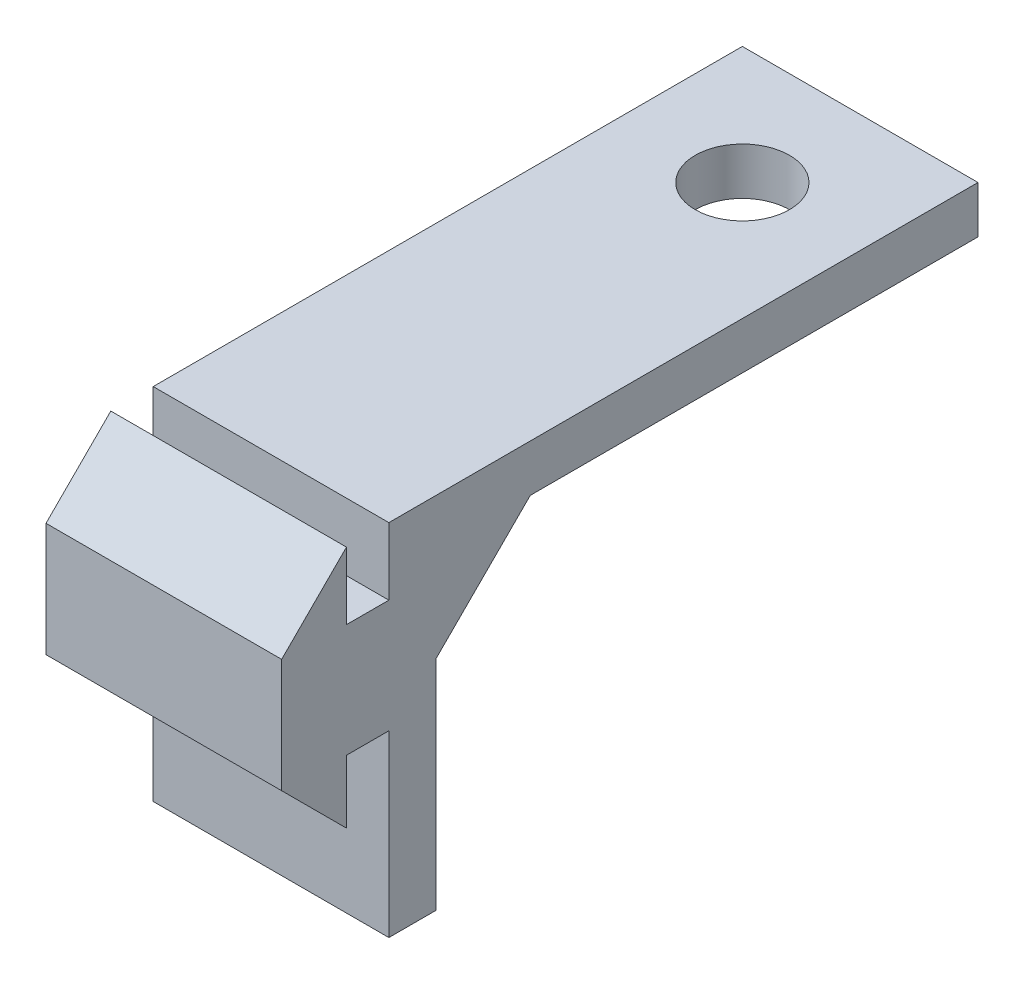
ISO-10303-21;
HEADER;
FILE_DESCRIPTION(('STEP AP214'),'2;1');
FILE_NAME('part.step','',(''),(''),'','','');
FILE_SCHEMA(('AUTOMOTIVE_DESIGN { 1 0 10303 214 1 1 1 1 }'));
ENDSEC;
DATA;
#1=APPLICATION_CONTEXT('core data for automotive mechanical design processes');
#2=APPLICATION_PROTOCOL_DEFINITION('international standard','automotive_design',2000,#1);
#3=PRODUCT_CONTEXT('',#1,'mechanical');
#4=PRODUCT('Part','Part','',(#3));
#5=PRODUCT_RELATED_PRODUCT_CATEGORY('part','',(#4));
#6=PRODUCT_DEFINITION_FORMATION('','',#4);
#7=PRODUCT_DEFINITION_CONTEXT('part definition',#1,'design');
#8=PRODUCT_DEFINITION('design','',#6,#7);
#9=PRODUCT_DEFINITION_SHAPE('','',#8);
#10=(LENGTH_UNIT() NAMED_UNIT(*) SI_UNIT(.MILLI.,.METRE.));
#11=(NAMED_UNIT(*) PLANE_ANGLE_UNIT() SI_UNIT($,.RADIAN.));
#12=(NAMED_UNIT(*) SI_UNIT($,.STERADIAN.) SOLID_ANGLE_UNIT());
#13=UNCERTAINTY_MEASURE_WITH_UNIT(LENGTH_MEASURE(1.E-05),#10,'distance_accuracy_value','');
#14=(GEOMETRIC_REPRESENTATION_CONTEXT(3) GLOBAL_UNCERTAINTY_ASSIGNED_CONTEXT((#13)) GLOBAL_UNIT_ASSIGNED_CONTEXT((#10,
#11,#12)) REPRESENTATION_CONTEXT('',''));
#15=CARTESIAN_POINT('',(0.,0.,0.));
#16=DIRECTION('',(0.,0.,1.));
#17=DIRECTION('',(1.,0.,0.));
#18=AXIS2_PLACEMENT_3D('',#15,#16,#17);
#19=CARTESIAN_POINT('',(10.,0.,-2.));
#20=DIRECTION('',(0.,0.,1.));
#21=DIRECTION('',(1.,0.,0.));
#22=AXIS2_PLACEMENT_3D('',#19,#20,#21);
#23=PLANE('',#22);
#24=DIRECTION('',(0.,1.,0.));
#25=VECTOR('',#24,1.);
#26=CARTESIAN_POINT('',(0.,0.,-2.));
#27=LINE('',#26,#25);
#28=CARTESIAN_POINT('',(0.,0.,-2.));
#29=VERTEX_POINT('',#28);
#30=CARTESIAN_POINT('',(0.,9.25000000000001,-2.));
#31=VERTEX_POINT('',#30);
#32=EDGE_CURVE('E174',#29,#31,#27,.T.);
#33=ORIENTED_EDGE('',*,*,#32,.T.);
#34=DIRECTION('',(-1.,0.,0.));
#35=VECTOR('',#34,1.);
#36=CARTESIAN_POINT('',(10.,9.25000000000001,-2.));
#37=LINE('',#36,#35);
#38=CARTESIAN_POINT('',(10.,9.25000000000001,-2.));
#39=VERTEX_POINT('',#38);
#40=EDGE_CURVE('E11',#39,#31,#37,.T.);
#41=ORIENTED_EDGE('',*,*,#40,.F.);
#42=DIRECTION('',(0.,1.,0.));
#43=VECTOR('',#42,1.);
#44=CARTESIAN_POINT('',(10.,0.,-2.));
#45=LINE('',#44,#43);
#46=CARTESIAN_POINT('',(10.,0.,-2.));
#47=VERTEX_POINT('',#46);
#48=EDGE_CURVE('E213',#47,#39,#45,.T.);
#49=ORIENTED_EDGE('',*,*,#48,.F.);
#50=DIRECTION('',(-1.,0.,0.));
#51=VECTOR('',#50,1.);
#52=CARTESIAN_POINT('',(10.,0.,-2.));
#53=LINE('',#52,#51);
#54=EDGE_CURVE('E51',#47,#29,#53,.T.);
#55=ORIENTED_EDGE('',*,*,#54,.T.);
#56=EDGE_LOOP('',(#33,#41,#49,#55));
#57=FACE_BOUND('',#56,.T.);
#58=ADVANCED_FACE('F35',(#57),#23,.F.);
#59=CARTESIAN_POINT('',(10.,3.62500000000001,3.625));
#60=DIRECTION('',(0.,0.707106781186548,0.707106781186547));
#61=DIRECTION('',(0.,-0.707106781186547,0.707106781186548));
#62=AXIS2_PLACEMENT_3D('',#59,#60,#61);
#63=PLANE('',#62);
#64=DIRECTION('',(0.,0.707106781186547,-0.707106781186548));
#65=VECTOR('',#64,1.);
#66=CARTESIAN_POINT('',(0.,3.62500000000001,3.625));
#67=LINE('',#66,#65);
#68=CARTESIAN_POINT('',(0.,13.25,-6.));
#69=VERTEX_POINT('',#68);
#70=EDGE_CURVE('E176',#31,#69,#67,.T.);
#71=ORIENTED_EDGE('',*,*,#70,.T.);
#72=DIRECTION('',(-1.,0.,0.));
#73=VECTOR('',#72,1.);
#74=CARTESIAN_POINT('',(10.,13.25,-6.));
#75=LINE('',#74,#73);
#76=CARTESIAN_POINT('',(10.,13.25,-6.));
#77=VERTEX_POINT('',#76);
#78=EDGE_CURVE('E43',#77,#69,#75,.T.);
#79=ORIENTED_EDGE('',*,*,#78,.F.);
#80=DIRECTION('',(0.,0.707106781186547,-0.707106781186548));
#81=VECTOR('',#80,1.);
#82=CARTESIAN_POINT('',(10.,3.62500000000001,3.625));
#83=LINE('',#82,#81);
#84=EDGE_CURVE('E110',#39,#77,#83,.T.);
#85=ORIENTED_EDGE('',*,*,#84,.F.);
#86=ORIENTED_EDGE('',*,*,#40,.T.);
#87=EDGE_LOOP('',(#71,#79,#85,#86));
#88=FACE_BOUND('',#87,.T.);
#89=ADVANCED_FACE('F288',(#88),#63,.F.);
#90=CARTESIAN_POINT('',(10.,13.25,0.));
#91=DIRECTION('',(0.,1.,0.));
#92=DIRECTION('',(0.,0.,1.));
#93=AXIS2_PLACEMENT_3D('',#90,#91,#92);
#94=PLANE('',#93);
#95=CARTESIAN_POINT('',(5.,13.25,-20.));
#96=DIRECTION('',(0.,1.,0.));
#97=DIRECTION('',(0.,0.,1.));
#98=AXIS2_PLACEMENT_3D('',#95,#96,#97);
#99=CIRCLE('',#98,2.);
#100=CARTESIAN_POINT('',(5.,13.25,-18.));
#101=VERTEX_POINT('',#100);
#102=EDGE_CURVE('E177',#101,#101,#99,.T.);
#103=ORIENTED_EDGE('',*,*,#102,.T.);
#104=EDGE_LOOP('',(#103));
#105=FACE_BOUND('',#104,.T.);
#106=DIRECTION('',(0.,0.,-1.));
#107=VECTOR('',#106,1.);
#108=CARTESIAN_POINT('',(0.,13.25,0.));
#109=LINE('',#108,#107);
#110=CARTESIAN_POINT('',(0.,13.25,-25.));
#111=VERTEX_POINT('',#110);
#112=EDGE_CURVE('E179',#69,#111,#109,.T.);
#113=ORIENTED_EDGE('',*,*,#112,.T.);
#114=DIRECTION('',(-1.,0.,0.));
#115=VECTOR('',#114,1.);
#116=CARTESIAN_POINT('',(10.,13.25,-25.));
#117=LINE('',#116,#115);
#118=CARTESIAN_POINT('',(10.,13.25,-25.));
#119=VERTEX_POINT('',#118);
#120=EDGE_CURVE('E235',#119,#111,#117,.T.);
#121=ORIENTED_EDGE('',*,*,#120,.F.);
#122=DIRECTION('',(0.,0.,-1.));
#123=VECTOR('',#122,1.);
#124=CARTESIAN_POINT('',(10.,13.25,0.));
#125=LINE('',#124,#123);
#126=EDGE_CURVE('E242',#77,#119,#125,.T.);
#127=ORIENTED_EDGE('',*,*,#126,.F.);
#128=ORIENTED_EDGE('',*,*,#78,.T.);
#129=EDGE_LOOP('',(#113,#121,#127,#128));
#130=FACE_BOUND('',#129,.T.);
#131=ADVANCED_FACE('F240',(#105,#130),#94,.F.);
#132=CARTESIAN_POINT('',(10.,0.,-25.));
#133=DIRECTION('',(0.,0.,-1.));
#134=DIRECTION('',(-1.,0.,0.));
#135=AXIS2_PLACEMENT_3D('',#132,#133,#134);
#136=PLANE('',#135);
#137=DIRECTION('',(0.,-1.,0.));
#138=VECTOR('',#137,1.);
#139=CARTESIAN_POINT('',(0.,0.,-25.));
#140=LINE('',#139,#138);
#141=CARTESIAN_POINT('',(0.,15.25,-25.));
#142=VERTEX_POINT('',#141);
#143=EDGE_CURVE('E182',#142,#111,#140,.T.);
#144=ORIENTED_EDGE('',*,*,#143,.F.);
#145=DIRECTION('',(-1.,0.,0.));
#146=VECTOR('',#145,1.);
#147=CARTESIAN_POINT('',(10.,15.25,-25.));
#148=LINE('',#147,#146);
#149=CARTESIAN_POINT('',(10.,15.25,-25.));
#150=VERTEX_POINT('',#149);
#151=EDGE_CURVE('E233',#150,#142,#148,.T.);
#152=ORIENTED_EDGE('',*,*,#151,.F.);
#153=DIRECTION('',(0.,-1.,0.));
#154=VECTOR('',#153,1.);
#155=CARTESIAN_POINT('',(10.,0.,-25.));
#156=LINE('',#155,#154);
#157=EDGE_CURVE('E252',#150,#119,#156,.T.);
#158=ORIENTED_EDGE('',*,*,#157,.T.);
#159=ORIENTED_EDGE('',*,*,#120,.T.);
#160=EDGE_LOOP('',(#144,#152,#158,#159));
#161=FACE_BOUND('',#160,.T.);
#162=ADVANCED_FACE('F248',(#161),#136,.T.);
#163=CARTESIAN_POINT('',(10.,15.25,0.));
#164=DIRECTION('',(0.,-1.,0.));
#165=DIRECTION('',(0.,0.,-1.));
#166=AXIS2_PLACEMENT_3D('',#163,#164,#165);
#167=PLANE('',#166);
#168=CARTESIAN_POINT('',(5.,15.25,-20.));
#169=DIRECTION('',(0.,1.,0.));
#170=DIRECTION('',(0.,0.,1.));
#171=AXIS2_PLACEMENT_3D('',#168,#169,#170);
#172=CIRCLE('',#171,2.);
#173=CARTESIAN_POINT('',(5.,15.25,-18.));
#174=VERTEX_POINT('',#173);
#175=EDGE_CURVE('E297',#174,#174,#172,.T.);
#176=ORIENTED_EDGE('',*,*,#175,.F.);
#177=EDGE_LOOP('',(#176));
#178=FACE_BOUND('',#177,.T.);
#179=DIRECTION('',(0.,0.,1.));
#180=VECTOR('',#179,1.);
#181=CARTESIAN_POINT('',(0.,15.25,0.));
#182=LINE('',#181,#180);
#183=CARTESIAN_POINT('',(0.,15.25,0.));
#184=VERTEX_POINT('',#183);
#185=EDGE_CURVE('E185',#142,#184,#182,.T.);
#186=ORIENTED_EDGE('',*,*,#185,.T.);
#187=DIRECTION('',(-1.,0.,0.));
#188=VECTOR('',#187,1.);
#189=CARTESIAN_POINT('',(10.,15.25,0.));
#190=LINE('',#189,#188);
#191=CARTESIAN_POINT('',(10.,15.25,0.));
#192=VERTEX_POINT('',#191);
#193=EDGE_CURVE('E231',#192,#184,#190,.T.);
#194=ORIENTED_EDGE('',*,*,#193,.F.);
#195=DIRECTION('',(0.,0.,1.));
#196=VECTOR('',#195,1.);
#197=CARTESIAN_POINT('',(10.,15.25,0.));
#198=LINE('',#197,#196);
#199=EDGE_CURVE('E253',#150,#192,#198,.T.);
#200=ORIENTED_EDGE('',*,*,#199,.F.);
#201=ORIENTED_EDGE('',*,*,#151,.T.);
#202=EDGE_LOOP('',(#186,#194,#200,#201));
#203=FACE_BOUND('',#202,.T.);
#204=ADVANCED_FACE('F304',(#178,#203),#167,.F.);
#205=CARTESIAN_POINT('',(10.,0.,0.));
#206=DIRECTION('',(0.,0.,1.));
#207=DIRECTION('',(1.,0.,0.));
#208=AXIS2_PLACEMENT_3D('',#205,#206,#207);
#209=PLANE('',#208);
#210=DIRECTION('',(0.,1.,0.));
#211=VECTOR('',#210,1.);
#212=CARTESIAN_POINT('',(0.,0.,0.));
#213=LINE('',#212,#211);
#214=CARTESIAN_POINT('',(0.,12.4,0.));
#215=VERTEX_POINT('',#214);
#216=EDGE_CURVE('E188',#215,#184,#213,.T.);
#217=ORIENTED_EDGE('',*,*,#216,.F.);
#218=DIRECTION('',(-1.,0.,0.));
#219=VECTOR('',#218,1.);
#220=CARTESIAN_POINT('',(10.,12.4,0.));
#221=LINE('',#220,#219);
#222=CARTESIAN_POINT('',(10.,12.4,0.));
#223=VERTEX_POINT('',#222);
#224=EDGE_CURVE('E229',#223,#215,#221,.T.);
#225=ORIENTED_EDGE('',*,*,#224,.F.);
#226=DIRECTION('',(0.,1.,0.));
#227=VECTOR('',#226,1.);
#228=CARTESIAN_POINT('',(10.,0.,0.));
#229=LINE('',#228,#227);
#230=EDGE_CURVE('E255',#223,#192,#229,.T.);
#231=ORIENTED_EDGE('',*,*,#230,.T.);
#232=ORIENTED_EDGE('',*,*,#193,.T.);
#233=EDGE_LOOP('',(#217,#225,#231,#232));
#234=FACE_BOUND('',#233,.T.);
#235=ADVANCED_FACE('F307',(#234),#209,.T.);
#236=CARTESIAN_POINT('',(10.,12.4,0.));
#237=DIRECTION('',(0.,1.,0.));
#238=DIRECTION('',(0.,0.,1.));
#239=AXIS2_PLACEMENT_3D('',#236,#237,#238);
#240=PLANE('',#239);
#241=DIRECTION('',(0.,0.,-1.));
#242=VECTOR('',#241,1.);
#243=CARTESIAN_POINT('',(0.,12.4,0.));
#244=LINE('',#243,#242);
#245=CARTESIAN_POINT('',(0.,12.4,1.8));
#246=VERTEX_POINT('',#245);
#247=EDGE_CURVE('E191',#246,#215,#244,.T.);
#248=ORIENTED_EDGE('',*,*,#247,.F.);
#249=DIRECTION('',(-1.,0.,0.));
#250=VECTOR('',#249,1.);
#251=CARTESIAN_POINT('',(10.,12.4,1.8));
#252=LINE('',#251,#250);
#253=CARTESIAN_POINT('',(10.,12.4,1.8));
#254=VERTEX_POINT('',#253);
#255=EDGE_CURVE('E227',#254,#246,#252,.T.);
#256=ORIENTED_EDGE('',*,*,#255,.F.);
#257=DIRECTION('',(0.,0.,-1.));
#258=VECTOR('',#257,1.);
#259=CARTESIAN_POINT('',(10.,12.4,0.));
#260=LINE('',#259,#258);
#261=EDGE_CURVE('E262',#254,#223,#260,.T.);
#262=ORIENTED_EDGE('',*,*,#261,.T.);
#263=ORIENTED_EDGE('',*,*,#224,.T.);
#264=EDGE_LOOP('',(#248,#256,#262,#263));
#265=FACE_BOUND('',#264,.T.);
#266=ADVANCED_FACE('F317',(#265),#240,.T.);
#267=CARTESIAN_POINT('',(10.,0.,1.8));
#268=DIRECTION('',(0.,0.,1.));
#269=DIRECTION('',(1.,0.,0.));
#270=AXIS2_PLACEMENT_3D('',#267,#268,#269);
#271=PLANE('',#270);
#272=DIRECTION('',(0.,1.,0.));
#273=VECTOR('',#272,1.);
#274=CARTESIAN_POINT('',(0.,0.,1.8));
#275=LINE('',#274,#273);
#276=CARTESIAN_POINT('',(0.,15.25,1.8));
#277=VERTEX_POINT('',#276);
#278=EDGE_CURVE('E194',#246,#277,#275,.T.);
#279=ORIENTED_EDGE('',*,*,#278,.T.);
#280=DIRECTION('',(-1.,0.,0.));
#281=VECTOR('',#280,1.);
#282=CARTESIAN_POINT('',(10.,15.25,1.8));
#283=LINE('',#282,#281);
#284=CARTESIAN_POINT('',(10.,15.25,1.8));
#285=VERTEX_POINT('',#284);
#286=EDGE_CURVE('E224',#285,#277,#283,.T.);
#287=ORIENTED_EDGE('',*,*,#286,.F.);
#288=DIRECTION('',(0.,1.,0.));
#289=VECTOR('',#288,1.);
#290=CARTESIAN_POINT('',(10.,0.,1.8));
#291=LINE('',#290,#289);
#292=EDGE_CURVE('E265',#254,#285,#291,.T.);
#293=ORIENTED_EDGE('',*,*,#292,.F.);
#294=ORIENTED_EDGE('',*,*,#255,.T.);
#295=EDGE_LOOP('',(#279,#287,#293,#294));
#296=FACE_BOUND('',#295,.T.);
#297=ADVANCED_FACE('F321',(#296),#271,.F.);
#298=CARTESIAN_POINT('',(10.,8.52499999999992,8.52500000000001));
#299=DIRECTION('',(0.,-0.707106781186544,-0.707106781186551));
#300=DIRECTION('',(0.,0.707106781186551,-0.707106781186544));
#301=AXIS2_PLACEMENT_3D('',#298,#299,#300);
#302=PLANE('',#301);
#303=DIRECTION('',(0.,-0.707106781186551,0.707106781186544));
#304=VECTOR('',#303,1.);
#305=CARTESIAN_POINT('',(0.,8.52499999999992,8.52500000000001));
#306=LINE('',#305,#304);
#307=CARTESIAN_POINT('',(0.,12.5,4.54999999999996));
#308=VERTEX_POINT('',#307);
#309=EDGE_CURVE('E196',#277,#308,#306,.T.);
#310=ORIENTED_EDGE('',*,*,#309,.T.);
#311=DIRECTION('',(-1.,0.,0.));
#312=VECTOR('',#311,1.);
#313=CARTESIAN_POINT('',(10.,12.5,4.54999999999996));
#314=LINE('',#313,#312);
#315=CARTESIAN_POINT('',(10.,12.5,4.54999999999996));
#316=VERTEX_POINT('',#315);
#317=EDGE_CURVE('E221',#316,#308,#314,.T.);
#318=ORIENTED_EDGE('',*,*,#317,.F.);
#319=DIRECTION('',(0.,-0.707106781186551,0.707106781186544));
#320=VECTOR('',#319,1.);
#321=CARTESIAN_POINT('',(10.,8.52499999999992,8.52500000000001));
#322=LINE('',#321,#320);
#323=EDGE_CURVE('E267',#285,#316,#322,.T.);
#324=ORIENTED_EDGE('',*,*,#323,.F.);
#325=ORIENTED_EDGE('',*,*,#286,.T.);
#326=EDGE_LOOP('',(#310,#318,#324,#325));
#327=FACE_BOUND('',#326,.T.);
#328=ADVANCED_FACE('F327',(#327),#302,.F.);
#329=CARTESIAN_POINT('',(10.,0.,4.54999999999995));
#330=DIRECTION('',(0.,0.,-1.));
#331=DIRECTION('',(0.,1.,0.));
#332=AXIS2_PLACEMENT_3D('',#329,#330,#331);
#333=PLANE('',#332);
#334=DIRECTION('',(0.,-1.,0.));
#335=VECTOR('',#334,1.);
#336=CARTESIAN_POINT('',(0.,0.,4.54999999999995));
#337=LINE('',#336,#335);
#338=CARTESIAN_POINT('',(0.,7.6716806219514,4.54999999999995));
#339=VERTEX_POINT('',#338);
#340=EDGE_CURVE('E198',#308,#339,#337,.T.);
#341=ORIENTED_EDGE('',*,*,#340,.T.);
#342=DIRECTION('',(-1.,0.,0.));
#343=VECTOR('',#342,1.);
#344=CARTESIAN_POINT('',(10.,7.6716806219514,4.54999999999995));
#345=LINE('',#344,#343);
#346=CARTESIAN_POINT('',(10.,7.6716806219514,4.54999999999995));
#347=VERTEX_POINT('',#346);
#348=EDGE_CURVE('E219',#347,#339,#345,.T.);
#349=ORIENTED_EDGE('',*,*,#348,.F.);
#350=DIRECTION('',(0.,-1.,0.));
#351=VECTOR('',#350,1.);
#352=CARTESIAN_POINT('',(10.,0.,4.54999999999995));
#353=LINE('',#352,#351);
#354=EDGE_CURVE('E269',#316,#347,#353,.T.);
#355=ORIENTED_EDGE('',*,*,#354,.F.);
#356=ORIENTED_EDGE('',*,*,#317,.T.);
#357=EDGE_LOOP('',(#341,#349,#355,#356));
#358=FACE_BOUND('',#357,.T.);
#359=ADVANCED_FACE('F331',(#358),#333,.F.);
#360=CARTESIAN_POINT('',(10.,1.56084031097572,-1.56084031097572));
#361=DIRECTION('',(0.,-0.707106781186548,0.707106781186548));
#362=DIRECTION('',(0.,-0.707106781186548,-0.707106781186548));
#363=AXIS2_PLACEMENT_3D('',#360,#361,#362);
#364=PLANE('',#363);
#365=DIRECTION('',(0.,0.707106781186548,0.707106781186548));
#366=VECTOR('',#365,1.);
#367=CARTESIAN_POINT('',(0.,1.56084031097572,-1.56084031097572));
#368=LINE('',#367,#366);
#369=CARTESIAN_POINT('',(0.,4.92168062195145,1.8));
#370=VERTEX_POINT('',#369);
#371=EDGE_CURVE('E201',#370,#339,#368,.T.);
#372=ORIENTED_EDGE('',*,*,#371,.F.);
#373=DIRECTION('',(-1.,0.,0.));
#374=VECTOR('',#373,1.);
#375=CARTESIAN_POINT('',(10.,4.92168062195145,1.8));
#376=LINE('',#375,#374);
#377=CARTESIAN_POINT('',(10.,4.92168062195145,1.8));
#378=VERTEX_POINT('',#377);
#379=EDGE_CURVE('E217',#378,#370,#376,.T.);
#380=ORIENTED_EDGE('',*,*,#379,.F.);
#381=DIRECTION('',(0.,0.707106781186548,0.707106781186548));
#382=VECTOR('',#381,1.);
#383=CARTESIAN_POINT('',(10.,1.56084031097572,-1.56084031097572));
#384=LINE('',#383,#382);
#385=EDGE_CURVE('E271',#378,#347,#384,.T.);
#386=ORIENTED_EDGE('',*,*,#385,.T.);
#387=ORIENTED_EDGE('',*,*,#348,.T.);
#388=EDGE_LOOP('',(#372,#380,#386,#387));
#389=FACE_BOUND('',#388,.T.);
#390=ADVANCED_FACE('F333',(#389),#364,.T.);
#391=CARTESIAN_POINT('',(10.,0.,1.8));
#392=DIRECTION('',(0.,0.,-1.));
#393=DIRECTION('',(0.,1.,0.));
#394=AXIS2_PLACEMENT_3D('',#391,#392,#393);
#395=PLANE('',#394);
#396=DIRECTION('',(0.,-1.,0.));
#397=VECTOR('',#396,1.);
#398=CARTESIAN_POINT('',(0.,0.,1.8));
#399=LINE('',#398,#397);
#400=CARTESIAN_POINT('',(0.,7.60000000000001,1.8));
#401=VERTEX_POINT('',#400);
#402=EDGE_CURVE('E204',#401,#370,#399,.T.);
#403=ORIENTED_EDGE('',*,*,#402,.F.);
#404=DIRECTION('',(-1.,0.,0.));
#405=VECTOR('',#404,1.);
#406=CARTESIAN_POINT('',(10.,7.60000000000001,1.8));
#407=LINE('',#406,#405);
#408=CARTESIAN_POINT('',(10.,7.60000000000001,1.8));
#409=VERTEX_POINT('',#408);
#410=EDGE_CURVE('E166',#409,#401,#407,.T.);
#411=ORIENTED_EDGE('',*,*,#410,.F.);
#412=DIRECTION('',(0.,-1.,0.));
#413=VECTOR('',#412,1.);
#414=CARTESIAN_POINT('',(10.,0.,1.8));
#415=LINE('',#414,#413);
#416=EDGE_CURVE('E156',#409,#378,#415,.T.);
#417=ORIENTED_EDGE('',*,*,#416,.T.);
#418=ORIENTED_EDGE('',*,*,#379,.T.);
#419=EDGE_LOOP('',(#403,#411,#417,#418));
#420=FACE_BOUND('',#419,.T.);
#421=ADVANCED_FACE('F275',(#420),#395,.T.);
#422=CARTESIAN_POINT('',(10.,7.60000000000001,0.));
#423=DIRECTION('',(0.,1.,0.));
#424=DIRECTION('',(0.,0.,1.));
#425=AXIS2_PLACEMENT_3D('',#422,#423,#424);
#426=PLANE('',#425);
#427=DIRECTION('',(0.,0.,-1.));
#428=VECTOR('',#427,1.);
#429=CARTESIAN_POINT('',(0.,7.60000000000001,0.));
#430=LINE('',#429,#428);
#431=CARTESIAN_POINT('',(0.,7.60000000000001,0.));
#432=VERTEX_POINT('',#431);
#433=EDGE_CURVE('E163',#401,#432,#430,.T.);
#434=ORIENTED_EDGE('',*,*,#433,.T.);
#435=DIRECTION('',(-1.,0.,0.));
#436=VECTOR('',#435,1.);
#437=CARTESIAN_POINT('',(10.,7.60000000000001,0.));
#438=LINE('',#437,#436);
#439=CARTESIAN_POINT('',(10.,7.60000000000001,0.));
#440=VERTEX_POINT('',#439);
#441=EDGE_CURVE('E160',#440,#432,#438,.T.);
#442=ORIENTED_EDGE('',*,*,#441,.F.);
#443=DIRECTION('',(0.,0.,-1.));
#444=VECTOR('',#443,1.);
#445=CARTESIAN_POINT('',(10.,7.60000000000001,0.));
#446=LINE('',#445,#444);
#447=EDGE_CURVE('E148',#409,#440,#446,.T.);
#448=ORIENTED_EDGE('',*,*,#447,.F.);
#449=ORIENTED_EDGE('',*,*,#410,.T.);
#450=EDGE_LOOP('',(#434,#442,#448,#449));
#451=FACE_BOUND('',#450,.T.);
#452=ADVANCED_FACE('F161',(#451),#426,.F.);
#453=CARTESIAN_POINT('',(10.,0.,0.));
#454=DIRECTION('',(0.,0.,1.));
#455=DIRECTION('',(1.,0.,0.));
#456=AXIS2_PLACEMENT_3D('',#453,#454,#455);
#457=PLANE('',#456);
#458=DIRECTION('',(0.,1.,0.));
#459=VECTOR('',#458,1.);
#460=CARTESIAN_POINT('',(0.,0.,0.));
#461=LINE('',#460,#459);
#462=CARTESIAN_POINT('',(0.,0.,0.));
#463=VERTEX_POINT('',#462);
#464=EDGE_CURVE('E208',#463,#432,#461,.T.);
#465=ORIENTED_EDGE('',*,*,#464,.F.);
#466=DIRECTION('',(-1.,0.,0.));
#467=VECTOR('',#466,1.);
#468=CARTESIAN_POINT('',(10.,0.,0.));
#469=LINE('',#468,#467);
#470=CARTESIAN_POINT('',(10.,0.,0.));
#471=VERTEX_POINT('',#470);
#472=EDGE_CURVE('E98',#471,#463,#469,.T.);
#473=ORIENTED_EDGE('',*,*,#472,.F.);
#474=DIRECTION('',(0.,1.,0.));
#475=VECTOR('',#474,1.);
#476=CARTESIAN_POINT('',(10.,0.,0.));
#477=LINE('',#476,#475);
#478=EDGE_CURVE('E153',#471,#440,#477,.T.);
#479=ORIENTED_EDGE('',*,*,#478,.T.);
#480=ORIENTED_EDGE('',*,*,#441,.T.);
#481=EDGE_LOOP('',(#465,#473,#479,#480));
#482=FACE_BOUND('',#481,.T.);
#483=ADVANCED_FACE('F168',(#482),#457,.T.);
#484=CARTESIAN_POINT('',(10.,0.,0.));
#485=DIRECTION('',(0.,-1.,0.));
#486=DIRECTION('',(0.,0.,-1.));
#487=AXIS2_PLACEMENT_3D('',#484,#485,#486);
#488=PLANE('',#487);
#489=DIRECTION('',(0.,0.,1.));
#490=VECTOR('',#489,1.);
#491=CARTESIAN_POINT('',(0.,0.,0.));
#492=LINE('',#491,#490);
#493=EDGE_CURVE('E210',#29,#463,#492,.T.);
#494=ORIENTED_EDGE('',*,*,#493,.F.);
#495=ORIENTED_EDGE('',*,*,#54,.F.);
#496=DIRECTION('',(0.,0.,1.));
#497=VECTOR('',#496,1.);
#498=CARTESIAN_POINT('',(10.,0.,0.));
#499=LINE('',#498,#497);
#500=EDGE_CURVE('E169',#47,#471,#499,.T.);
#501=ORIENTED_EDGE('',*,*,#500,.T.);
#502=ORIENTED_EDGE('',*,*,#472,.T.);
#503=EDGE_LOOP('',(#494,#495,#501,#502));
#504=FACE_BOUND('',#503,.T.);
#505=ADVANCED_FACE('F277',(#504),#488,.T.);
#506=CARTESIAN_POINT('',(10.,0.,0.));
#507=DIRECTION('',(1.,0.,0.));
#508=DIRECTION('',(0.,0.,-1.));
#509=AXIS2_PLACEMENT_3D('',#506,#507,#508);
#510=PLANE('',#509);
#511=ORIENTED_EDGE('',*,*,#48,.T.);
#512=ORIENTED_EDGE('',*,*,#84,.T.);
#513=ORIENTED_EDGE('',*,*,#126,.T.);
#514=ORIENTED_EDGE('',*,*,#157,.F.);
#515=ORIENTED_EDGE('',*,*,#199,.T.);
#516=ORIENTED_EDGE('',*,*,#230,.F.);
#517=ORIENTED_EDGE('',*,*,#261,.F.);
#518=ORIENTED_EDGE('',*,*,#292,.T.);
#519=ORIENTED_EDGE('',*,*,#323,.T.);
#520=ORIENTED_EDGE('',*,*,#354,.T.);
#521=ORIENTED_EDGE('',*,*,#385,.F.);
#522=ORIENTED_EDGE('',*,*,#416,.F.);
#523=ORIENTED_EDGE('',*,*,#447,.T.);
#524=ORIENTED_EDGE('',*,*,#478,.F.);
#525=ORIENTED_EDGE('',*,*,#500,.F.);
#526=EDGE_LOOP('',(#511,#512,#513,#514,#515,#516,#517,#518,#519,#520,#521,#522,#523,#524,#525));
#527=FACE_BOUND('',#526,.T.);
#528=ADVANCED_FACE('F150',(#527),#510,.T.);
#529=CARTESIAN_POINT('',(0.,0.,0.));
#530=DIRECTION('',(1.,0.,0.));
#531=DIRECTION('',(0.,0.,-1.));
#532=AXIS2_PLACEMENT_3D('',#529,#530,#531);
#533=PLANE('',#532);
#534=ORIENTED_EDGE('',*,*,#32,.F.);
#535=ORIENTED_EDGE('',*,*,#493,.T.);
#536=ORIENTED_EDGE('',*,*,#464,.T.);
#537=ORIENTED_EDGE('',*,*,#433,.F.);
#538=ORIENTED_EDGE('',*,*,#402,.T.);
#539=ORIENTED_EDGE('',*,*,#371,.T.);
#540=ORIENTED_EDGE('',*,*,#340,.F.);
#541=ORIENTED_EDGE('',*,*,#309,.F.);
#542=ORIENTED_EDGE('',*,*,#278,.F.);
#543=ORIENTED_EDGE('',*,*,#247,.T.);
#544=ORIENTED_EDGE('',*,*,#216,.T.);
#545=ORIENTED_EDGE('',*,*,#185,.F.);
#546=ORIENTED_EDGE('',*,*,#143,.T.);
#547=ORIENTED_EDGE('',*,*,#112,.F.);
#548=ORIENTED_EDGE('',*,*,#70,.F.);
#549=EDGE_LOOP('',(#534,#535,#536,#537,#538,#539,#540,#541,#542,#543,#544,#545,#546,#547,#548));
#550=FACE_BOUND('',#549,.T.);
#551=ADVANCED_FACE('F244',(#550),#533,.F.);
#552=CARTESIAN_POINT('',(5.,12.25,-20.));
#553=DIRECTION('',(0.,1.,0.));
#554=DIRECTION('',(0.,0.,1.));
#555=AXIS2_PLACEMENT_3D('',#552,#553,#554);
#556=CYLINDRICAL_SURFACE('',#555,2.);
#557=ORIENTED_EDGE('',*,*,#175,.T.);
#558=EDGE_LOOP('',(#557));
#559=FACE_BOUND('',#558,.T.);
#560=ORIENTED_EDGE('',*,*,#102,.F.);
#561=EDGE_LOOP('',(#560));
#562=FACE_BOUND('',#561,.T.);
#563=ADVANCED_FACE('F301',(#559,#562),#556,.F.);
#564=CLOSED_SHELL('',(#58,#89,#131,#162,#204,#235,#266,#297,#328,#359,#390,#421,#452,#483,#505,
#528,#551,#563));
#565=MANIFOLD_SOLID_BREP('B2',#564);
#566=ADVANCED_BREP_SHAPE_REPRESENTATION('',(#18,#565),#14);
#567=SHAPE_DEFINITION_REPRESENTATION(#9,#566);
ENDSEC;
END-ISO-10303-21;
